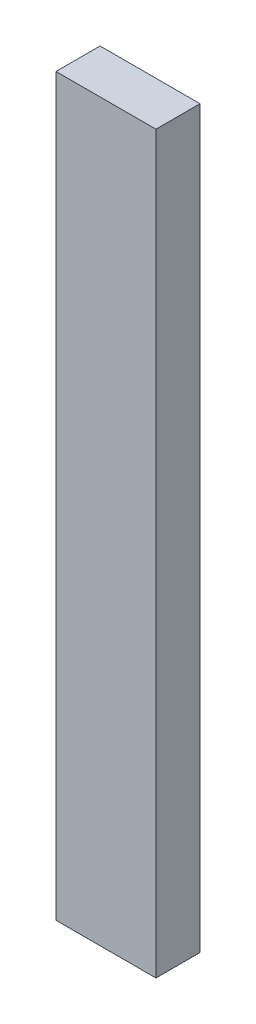
ISO-10303-21;
HEADER;
FILE_DESCRIPTION(('STEP AP214'),'2;1');
FILE_NAME('part.step','',(''),(''),'','','');
FILE_SCHEMA(('AUTOMOTIVE_DESIGN { 1 0 10303 214 1 1 1 1 }'));
ENDSEC;
DATA;
#1=APPLICATION_CONTEXT('core data for automotive mechanical design processes');
#2=APPLICATION_PROTOCOL_DEFINITION('international standard','automotive_design',2000,#1);
#3=PRODUCT_CONTEXT('',#1,'mechanical');
#4=PRODUCT('Part','Part','',(#3));
#5=PRODUCT_RELATED_PRODUCT_CATEGORY('part','',(#4));
#6=PRODUCT_DEFINITION_FORMATION('','',#4);
#7=PRODUCT_DEFINITION_CONTEXT('part definition',#1,'design');
#8=PRODUCT_DEFINITION('design','',#6,#7);
#9=PRODUCT_DEFINITION_SHAPE('','',#8);
#10=(LENGTH_UNIT() NAMED_UNIT(*) SI_UNIT(.MILLI.,.METRE.));
#11=(NAMED_UNIT(*) PLANE_ANGLE_UNIT() SI_UNIT($,.RADIAN.));
#12=(NAMED_UNIT(*) SI_UNIT($,.STERADIAN.) SOLID_ANGLE_UNIT());
#13=UNCERTAINTY_MEASURE_WITH_UNIT(LENGTH_MEASURE(1.E-05),#10,'distance_accuracy_value','');
#14=(GEOMETRIC_REPRESENTATION_CONTEXT(3) GLOBAL_UNCERTAINTY_ASSIGNED_CONTEXT((#13)) GLOBAL_UNIT_ASSIGNED_CONTEXT((#10,
#11,#12)) REPRESENTATION_CONTEXT('',''));
#15=CARTESIAN_POINT('',(0.,0.,0.));
#16=DIRECTION('',(0.,0.,1.));
#17=DIRECTION('',(1.,0.,0.));
#18=AXIS2_PLACEMENT_3D('',#15,#16,#17);
#19=CARTESIAN_POINT('',(1.7,12.5,1.5));
#20=DIRECTION('',(-1.,0.,0.));
#21=DIRECTION('',(0.,-1.,0.));
#22=AXIS2_PLACEMENT_3D('',#19,#20,#21);
#23=PLANE('',#22);
#24=DIRECTION('',(0.,1.,0.));
#25=VECTOR('',#24,1.);
#26=CARTESIAN_POINT('',(1.7,12.5,0.));
#27=LINE('',#26,#25);
#28=CARTESIAN_POINT('',(1.7,-12.5,0.));
#29=VERTEX_POINT('',#28);
#30=CARTESIAN_POINT('',(1.7,12.5,0.));
#31=VERTEX_POINT('',#30);
#32=EDGE_CURVE('E113',#29,#31,#27,.T.);
#33=ORIENTED_EDGE('',*,*,#32,.T.);
#34=DIRECTION('',(0.,0.,-1.));
#35=VECTOR('',#34,1.);
#36=CARTESIAN_POINT('',(1.7,12.5,1.5));
#37=LINE('',#36,#35);
#38=CARTESIAN_POINT('',(1.7,12.5,1.5));
#39=VERTEX_POINT('',#38);
#40=EDGE_CURVE('E11',#39,#31,#37,.T.);
#41=ORIENTED_EDGE('',*,*,#40,.F.);
#42=DIRECTION('',(0.,1.,0.));
#43=VECTOR('',#42,1.);
#44=CARTESIAN_POINT('',(1.7,12.5,1.5));
#45=LINE('',#44,#43);
#46=CARTESIAN_POINT('',(1.7,-12.5,1.5));
#47=VERTEX_POINT('',#46);
#48=EDGE_CURVE('E97',#47,#39,#45,.T.);
#49=ORIENTED_EDGE('',*,*,#48,.F.);
#50=DIRECTION('',(0.,0.,-1.));
#51=VECTOR('',#50,1.);
#52=CARTESIAN_POINT('',(1.7,-12.5,1.5));
#53=LINE('',#52,#51);
#54=EDGE_CURVE('E109',#47,#29,#53,.T.);
#55=ORIENTED_EDGE('',*,*,#54,.T.);
#56=EDGE_LOOP('',(#33,#41,#49,#55));
#57=FACE_BOUND('',#56,.T.);
#58=ADVANCED_FACE('F45',(#57),#23,.F.);
#59=CARTESIAN_POINT('',(-1.7,12.5,1.5));
#60=DIRECTION('',(0.,-1.,0.));
#61=DIRECTION('',(0.,0.,-1.));
#62=AXIS2_PLACEMENT_3D('',#59,#60,#61);
#63=PLANE('',#62);
#64=DIRECTION('',(-1.,0.,0.));
#65=VECTOR('',#64,1.);
#66=CARTESIAN_POINT('',(-1.7,12.5,0.));
#67=LINE('',#66,#65);
#68=CARTESIAN_POINT('',(-1.7,12.5,0.));
#69=VERTEX_POINT('',#68);
#70=EDGE_CURVE('E102',#31,#69,#67,.T.);
#71=ORIENTED_EDGE('',*,*,#70,.T.);
#72=DIRECTION('',(0.,0.,-1.));
#73=VECTOR('',#72,1.);
#74=CARTESIAN_POINT('',(-1.7,12.5,1.5));
#75=LINE('',#74,#73);
#76=CARTESIAN_POINT('',(-1.7,12.5,1.5));
#77=VERTEX_POINT('',#76);
#78=EDGE_CURVE('E54',#77,#69,#75,.T.);
#79=ORIENTED_EDGE('',*,*,#78,.F.);
#80=DIRECTION('',(-1.,0.,0.));
#81=VECTOR('',#80,1.);
#82=CARTESIAN_POINT('',(-1.7,12.5,1.5));
#83=LINE('',#82,#81);
#84=EDGE_CURVE('E92',#39,#77,#83,.T.);
#85=ORIENTED_EDGE('',*,*,#84,.F.);
#86=ORIENTED_EDGE('',*,*,#40,.T.);
#87=EDGE_LOOP('',(#71,#79,#85,#86));
#88=FACE_BOUND('',#87,.T.);
#89=ADVANCED_FACE('F101',(#88),#63,.F.);
#90=CARTESIAN_POINT('',(-1.7,12.5,1.5));
#91=DIRECTION('',(1.,0.,0.));
#92=DIRECTION('',(0.,1.,0.));
#93=AXIS2_PLACEMENT_3D('',#90,#91,#92);
#94=PLANE('',#93);
#95=DIRECTION('',(0.,-1.,0.));
#96=VECTOR('',#95,1.);
#97=CARTESIAN_POINT('',(-1.7,12.5,0.));
#98=LINE('',#97,#96);
#99=CARTESIAN_POINT('',(-1.7,-12.5,0.));
#100=VERTEX_POINT('',#99);
#101=EDGE_CURVE('E79',#69,#100,#98,.T.);
#102=ORIENTED_EDGE('',*,*,#101,.T.);
#103=DIRECTION('',(0.,0.,-1.));
#104=VECTOR('',#103,1.);
#105=CARTESIAN_POINT('',(-1.7,-12.5,1.5));
#106=LINE('',#105,#104);
#107=CARTESIAN_POINT('',(-1.7,-12.5,1.5));
#108=VERTEX_POINT('',#107);
#109=EDGE_CURVE('E104',#108,#100,#106,.T.);
#110=ORIENTED_EDGE('',*,*,#109,.F.);
#111=DIRECTION('',(0.,-1.,0.));
#112=VECTOR('',#111,1.);
#113=CARTESIAN_POINT('',(-1.7,12.5,1.5));
#114=LINE('',#113,#112);
#115=EDGE_CURVE('E95',#77,#108,#114,.T.);
#116=ORIENTED_EDGE('',*,*,#115,.F.);
#117=ORIENTED_EDGE('',*,*,#78,.T.);
#118=EDGE_LOOP('',(#102,#110,#116,#117));
#119=FACE_BOUND('',#118,.T.);
#120=ADVANCED_FACE('F105',(#119),#94,.F.);
#121=CARTESIAN_POINT('',(-1.7,-12.5,1.5));
#122=DIRECTION('',(0.,1.,0.));
#123=DIRECTION('',(0.,0.,1.));
#124=AXIS2_PLACEMENT_3D('',#121,#122,#123);
#125=PLANE('',#124);
#126=DIRECTION('',(1.,0.,0.));
#127=VECTOR('',#126,1.);
#128=CARTESIAN_POINT('',(-1.7,-12.5,0.));
#129=LINE('',#128,#127);
#130=EDGE_CURVE('E85',#100,#29,#129,.T.);
#131=ORIENTED_EDGE('',*,*,#130,.T.);
#132=ORIENTED_EDGE('',*,*,#54,.F.);
#133=DIRECTION('',(1.,0.,0.));
#134=VECTOR('',#133,1.);
#135=CARTESIAN_POINT('',(-1.7,-12.5,1.5));
#136=LINE('',#135,#134);
#137=EDGE_CURVE('E62',#108,#47,#136,.T.);
#138=ORIENTED_EDGE('',*,*,#137,.F.);
#139=ORIENTED_EDGE('',*,*,#109,.T.);
#140=EDGE_LOOP('',(#131,#132,#138,#139));
#141=FACE_BOUND('',#140,.T.);
#142=ADVANCED_FACE('F126',(#141),#125,.F.);
#143=CARTESIAN_POINT('',(0.,0.,1.5));
#144=DIRECTION('',(0.,0.,1.));
#145=DIRECTION('',(1.,0.,0.));
#146=AXIS2_PLACEMENT_3D('',#143,#144,#145);
#147=PLANE('',#146);
#148=ORIENTED_EDGE('',*,*,#48,.T.);
#149=ORIENTED_EDGE('',*,*,#84,.T.);
#150=ORIENTED_EDGE('',*,*,#115,.T.);
#151=ORIENTED_EDGE('',*,*,#137,.T.);
#152=EDGE_LOOP('',(#148,#149,#150,#151));
#153=FACE_BOUND('',#152,.T.);
#154=ADVANCED_FACE('F93',(#153),#147,.T.);
#155=CARTESIAN_POINT('',(0.,0.,0.));
#156=DIRECTION('',(0.,0.,1.));
#157=DIRECTION('',(1.,0.,0.));
#158=AXIS2_PLACEMENT_3D('',#155,#156,#157);
#159=PLANE('',#158);
#160=ORIENTED_EDGE('',*,*,#32,.F.);
#161=ORIENTED_EDGE('',*,*,#130,.F.);
#162=ORIENTED_EDGE('',*,*,#101,.F.);
#163=ORIENTED_EDGE('',*,*,#70,.F.);
#164=EDGE_LOOP('',(#160,#161,#162,#163));
#165=FACE_BOUND('',#164,.T.);
#166=ADVANCED_FACE('F129',(#165),#159,.F.);
#167=CLOSED_SHELL('',(#58,#89,#120,#142,#154,#166));
#168=MANIFOLD_SOLID_BREP('B2',#167);
#169=ADVANCED_BREP_SHAPE_REPRESENTATION('',(#18,#168),#14);
#170=SHAPE_DEFINITION_REPRESENTATION(#9,#169);
ENDSEC;
END-ISO-10303-21;
